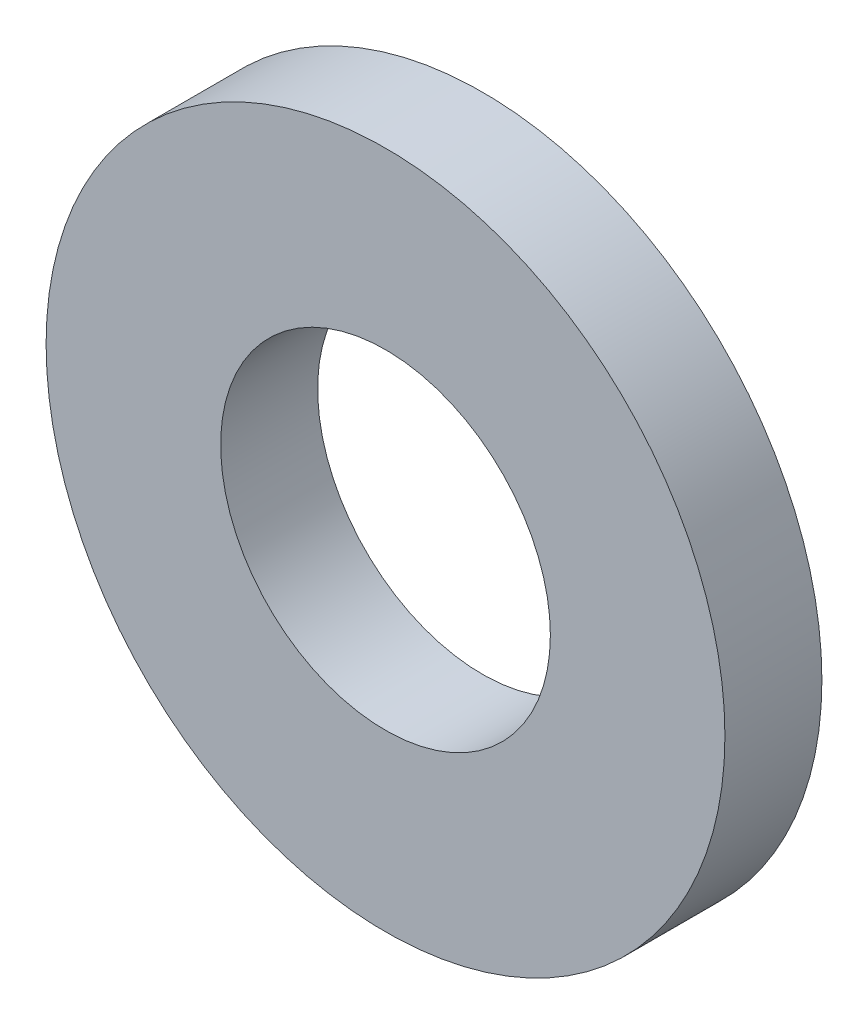
ISO-10303-21;
HEADER;
FILE_DESCRIPTION(('STEP AP214'),'2;1');
FILE_NAME('part.step','',(''),(''),'','','');
FILE_SCHEMA(('AUTOMOTIVE_DESIGN { 1 0 10303 214 1 1 1 1 }'));
ENDSEC;
DATA;
#1=APPLICATION_CONTEXT('core data for automotive mechanical design processes');
#2=APPLICATION_PROTOCOL_DEFINITION('international standard','automotive_design',2000,#1);
#3=PRODUCT_CONTEXT('',#1,'mechanical');
#4=PRODUCT('Part','Part','',(#3));
#5=PRODUCT_RELATED_PRODUCT_CATEGORY('part','',(#4));
#6=PRODUCT_DEFINITION_FORMATION('','',#4);
#7=PRODUCT_DEFINITION_CONTEXT('part definition',#1,'design');
#8=PRODUCT_DEFINITION('design','',#6,#7);
#9=PRODUCT_DEFINITION_SHAPE('','',#8);
#10=(LENGTH_UNIT() NAMED_UNIT(*) SI_UNIT(.MILLI.,.METRE.));
#11=(NAMED_UNIT(*) PLANE_ANGLE_UNIT() SI_UNIT($,.RADIAN.));
#12=(NAMED_UNIT(*) SI_UNIT($,.STERADIAN.) SOLID_ANGLE_UNIT());
#13=UNCERTAINTY_MEASURE_WITH_UNIT(LENGTH_MEASURE(1.E-05),#10,'distance_accuracy_value','');
#14=(GEOMETRIC_REPRESENTATION_CONTEXT(3) GLOBAL_UNCERTAINTY_ASSIGNED_CONTEXT((#13)) GLOBAL_UNIT_ASSIGNED_CONTEXT((#10,
#11,#12)) REPRESENTATION_CONTEXT('',''));
#15=CARTESIAN_POINT('',(0.,0.,0.));
#16=DIRECTION('',(0.,0.,1.));
#17=DIRECTION('',(1.,0.,0.));
#18=AXIS2_PLACEMENT_3D('',#15,#16,#17);
#19=CARTESIAN_POINT('',(0.,0.,1.));
#20=DIRECTION('',(0.,0.,-1.));
#21=DIRECTION('',(-1.,0.,0.));
#22=AXIS2_PLACEMENT_3D('',#19,#20,#21);
#23=CYLINDRICAL_SURFACE('',#22,3.5);
#24=CARTESIAN_POINT('',(0.,0.,1.));
#25=DIRECTION('',(0.,0.,1.));
#26=DIRECTION('',(1.,0.,0.));
#27=AXIS2_PLACEMENT_3D('',#24,#25,#26);
#28=CIRCLE('',#27,3.5);
#29=CARTESIAN_POINT('',(3.5,0.,1.));
#30=VERTEX_POINT('',#29);
#31=EDGE_CURVE('E10',#30,#30,#28,.T.);
#32=ORIENTED_EDGE('',*,*,#31,.F.);
#33=EDGE_LOOP('',(#32));
#34=FACE_BOUND('',#33,.T.);
#35=CARTESIAN_POINT('',(0.,0.,0.));
#36=DIRECTION('',(0.,0.,1.));
#37=DIRECTION('',(1.,0.,0.));
#38=AXIS2_PLACEMENT_3D('',#35,#36,#37);
#39=CIRCLE('',#38,3.5);
#40=CARTESIAN_POINT('',(3.5,0.,0.));
#41=VERTEX_POINT('',#40);
#42=EDGE_CURVE('E36',#41,#41,#39,.T.);
#43=ORIENTED_EDGE('',*,*,#42,.T.);
#44=EDGE_LOOP('',(#43));
#45=FACE_BOUND('',#44,.T.);
#46=ADVANCED_FACE('F33',(#34,#45),#23,.T.);
#47=CARTESIAN_POINT('',(0.,0.,1.));
#48=DIRECTION('',(0.,0.,1.));
#49=DIRECTION('',(1.,0.,0.));
#50=AXIS2_PLACEMENT_3D('',#47,#48,#49);
#51=PLANE('',#50);
#52=CARTESIAN_POINT('',(0.,0.,1.));
#53=DIRECTION('',(0.,0.,1.));
#54=DIRECTION('',(1.,0.,0.));
#55=AXIS2_PLACEMENT_3D('',#52,#53,#54);
#56=CIRCLE('',#55,1.7);
#57=CARTESIAN_POINT('',(1.7,0.,1.));
#58=VERTEX_POINT('',#57);
#59=EDGE_CURVE('E43',#58,#58,#56,.T.);
#60=ORIENTED_EDGE('',*,*,#59,.F.);
#61=EDGE_LOOP('',(#60));
#62=FACE_BOUND('',#61,.T.);
#63=ORIENTED_EDGE('',*,*,#31,.T.);
#64=EDGE_LOOP('',(#63));
#65=FACE_BOUND('',#64,.T.);
#66=ADVANCED_FACE('F54',(#62,#65),#51,.T.);
#67=CARTESIAN_POINT('',(0.,0.,0.));
#68=DIRECTION('',(0.,0.,1.));
#69=DIRECTION('',(1.,0.,0.));
#70=AXIS2_PLACEMENT_3D('',#67,#68,#69);
#71=PLANE('',#70);
#72=CARTESIAN_POINT('',(0.,0.,0.));
#73=DIRECTION('',(0.,0.,1.));
#74=DIRECTION('',(1.,0.,0.));
#75=AXIS2_PLACEMENT_3D('',#72,#73,#74);
#76=CIRCLE('',#75,1.7);
#77=CARTESIAN_POINT('',(1.7,0.,0.));
#78=VERTEX_POINT('',#77);
#79=EDGE_CURVE('E45',#78,#78,#76,.T.);
#80=ORIENTED_EDGE('',*,*,#79,.T.);
#81=EDGE_LOOP('',(#80));
#82=FACE_BOUND('',#81,.T.);
#83=ORIENTED_EDGE('',*,*,#42,.F.);
#84=EDGE_LOOP('',(#83));
#85=FACE_BOUND('',#84,.T.);
#86=ADVANCED_FACE('F56',(#82,#85),#71,.F.);
#87=CARTESIAN_POINT('',(0.,0.,1.));
#88=DIRECTION('',(0.,0.,-1.));
#89=DIRECTION('',(-1.,0.,0.));
#90=AXIS2_PLACEMENT_3D('',#87,#88,#89);
#91=CYLINDRICAL_SURFACE('',#90,1.7);
#92=ORIENTED_EDGE('',*,*,#59,.T.);
#93=EDGE_LOOP('',(#92));
#94=FACE_BOUND('',#93,.T.);
#95=ORIENTED_EDGE('',*,*,#79,.F.);
#96=EDGE_LOOP('',(#95));
#97=FACE_BOUND('',#96,.T.);
#98=ADVANCED_FACE('F51',(#94,#97),#91,.F.);
#99=CLOSED_SHELL('',(#46,#66,#86,#98));
#100=MANIFOLD_SOLID_BREP('B2',#99);
#101=ADVANCED_BREP_SHAPE_REPRESENTATION('',(#18,#100),#14);
#102=SHAPE_DEFINITION_REPRESENTATION(#9,#101);
ENDSEC;
END-ISO-10303-21;
